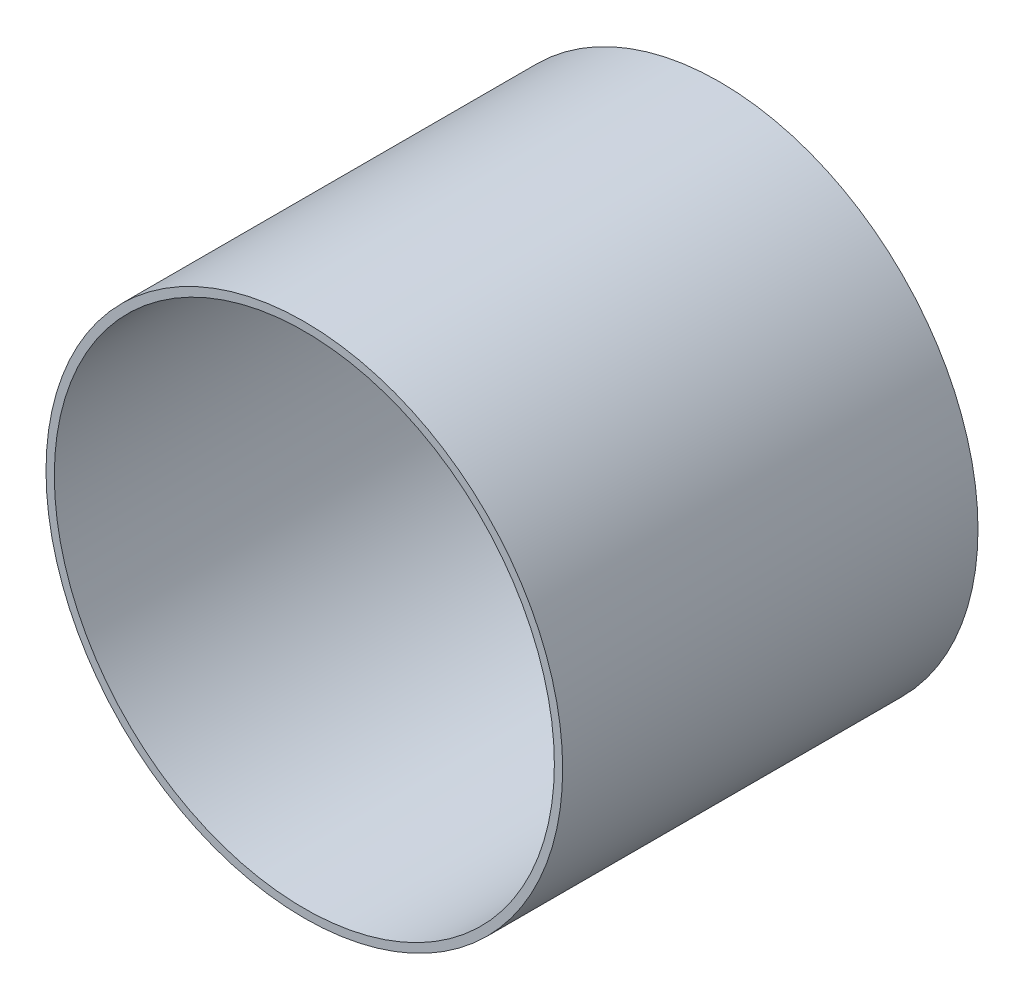
ISO-10303-21;
HEADER;
FILE_DESCRIPTION(('STEP AP214'),'2;1');
FILE_NAME('part.step','',(''),(''),'','','');
FILE_SCHEMA(('AUTOMOTIVE_DESIGN { 1 0 10303 214 1 1 1 1 }'));
ENDSEC;
DATA;
#1=APPLICATION_CONTEXT('core data for automotive mechanical design processes');
#2=APPLICATION_PROTOCOL_DEFINITION('international standard','automotive_design',2000,#1);
#3=PRODUCT_CONTEXT('',#1,'mechanical');
#4=PRODUCT('Part','Part','',(#3));
#5=PRODUCT_RELATED_PRODUCT_CATEGORY('part','',(#4));
#6=PRODUCT_DEFINITION_FORMATION('','',#4);
#7=PRODUCT_DEFINITION_CONTEXT('part definition',#1,'design');
#8=PRODUCT_DEFINITION('design','',#6,#7);
#9=PRODUCT_DEFINITION_SHAPE('','',#8);
#10=(LENGTH_UNIT() NAMED_UNIT(*) SI_UNIT(.MILLI.,.METRE.));
#11=(NAMED_UNIT(*) PLANE_ANGLE_UNIT() SI_UNIT($,.RADIAN.));
#12=(NAMED_UNIT(*) SI_UNIT($,.STERADIAN.) SOLID_ANGLE_UNIT());
#13=UNCERTAINTY_MEASURE_WITH_UNIT(LENGTH_MEASURE(1.E-05),#10,'distance_accuracy_value','');
#14=(GEOMETRIC_REPRESENTATION_CONTEXT(3) GLOBAL_UNCERTAINTY_ASSIGNED_CONTEXT((#13)) GLOBAL_UNIT_ASSIGNED_CONTEXT((#10,
#11,#12)) REPRESENTATION_CONTEXT('',''));
#15=CARTESIAN_POINT('',(0.,0.,0.));
#16=DIRECTION('',(0.,0.,1.));
#17=DIRECTION('',(1.,0.,0.));
#18=AXIS2_PLACEMENT_3D('',#15,#16,#17);
#19=CARTESIAN_POINT('',(0.,0.,50.));
#20=DIRECTION('',(0.,0.,1.));
#21=DIRECTION('',(1.,0.,0.));
#22=AXIS2_PLACEMENT_3D('',#19,#20,#21);
#23=PLANE('',#22);
#24=CARTESIAN_POINT('',(0.,0.,50.));
#25=DIRECTION('',(0.,0.,1.));
#26=DIRECTION('',(1.,0.,0.));
#27=AXIS2_PLACEMENT_3D('',#24,#25,#26);
#28=CIRCLE('',#27,31.1);
#29=CARTESIAN_POINT('',(31.1,0.,50.));
#30=VERTEX_POINT('',#29);
#31=EDGE_CURVE('E10',#30,#30,#28,.T.);
#32=ORIENTED_EDGE('',*,*,#31,.T.);
#33=EDGE_LOOP('',(#32));
#34=FACE_BOUND('',#33,.T.);
#35=CARTESIAN_POINT('',(0.,0.,50.));
#36=DIRECTION('',(0.,0.,1.));
#37=DIRECTION('',(1.,0.,0.));
#38=AXIS2_PLACEMENT_3D('',#35,#36,#37);
#39=CIRCLE('',#38,30.1);
#40=CARTESIAN_POINT('',(30.1,0.,50.));
#41=VERTEX_POINT('',#40);
#42=EDGE_CURVE('E50',#41,#41,#39,.T.);
#43=ORIENTED_EDGE('',*,*,#42,.F.);
#44=EDGE_LOOP('',(#43));
#45=FACE_BOUND('',#44,.T.);
#46=ADVANCED_FACE('F39',(#34,#45),#23,.T.);
#47=CARTESIAN_POINT('',(0.,0.,0.));
#48=DIRECTION('',(0.,0.,1.));
#49=DIRECTION('',(1.,0.,0.));
#50=AXIS2_PLACEMENT_3D('',#47,#48,#49);
#51=PLANE('',#50);
#52=CARTESIAN_POINT('',(0.,0.,0.));
#53=DIRECTION('',(0.,0.,1.));
#54=DIRECTION('',(1.,0.,0.));
#55=AXIS2_PLACEMENT_3D('',#52,#53,#54);
#56=CIRCLE('',#55,31.1);
#57=CARTESIAN_POINT('',(31.1,0.,0.));
#58=VERTEX_POINT('',#57);
#59=EDGE_CURVE('E43',#58,#58,#56,.T.);
#60=ORIENTED_EDGE('',*,*,#59,.F.);
#61=EDGE_LOOP('',(#60));
#62=FACE_BOUND('',#61,.T.);
#63=CARTESIAN_POINT('',(0.,0.,0.));
#64=DIRECTION('',(0.,0.,1.));
#65=DIRECTION('',(1.,0.,0.));
#66=AXIS2_PLACEMENT_3D('',#63,#64,#65);
#67=CIRCLE('',#66,30.1);
#68=CARTESIAN_POINT('',(30.1,0.,0.));
#69=VERTEX_POINT('',#68);
#70=EDGE_CURVE('E52',#69,#69,#67,.T.);
#71=ORIENTED_EDGE('',*,*,#70,.T.);
#72=EDGE_LOOP('',(#71));
#73=FACE_BOUND('',#72,.T.);
#74=ADVANCED_FACE('F62',(#62,#73),#51,.F.);
#75=CARTESIAN_POINT('',(0.,0.,50.));
#76=DIRECTION('',(0.,0.,-1.));
#77=DIRECTION('',(-1.,0.,0.));
#78=AXIS2_PLACEMENT_3D('',#75,#76,#77);
#79=CYLINDRICAL_SURFACE('',#78,31.1);
#80=ORIENTED_EDGE('',*,*,#31,.F.);
#81=EDGE_LOOP('',(#80));
#82=FACE_BOUND('',#81,.T.);
#83=ORIENTED_EDGE('',*,*,#59,.T.);
#84=EDGE_LOOP('',(#83));
#85=FACE_BOUND('',#84,.T.);
#86=ADVANCED_FACE('F41',(#82,#85),#79,.T.);
#87=CARTESIAN_POINT('',(0.,0.,50.));
#88=DIRECTION('',(0.,0.,-1.));
#89=DIRECTION('',(-1.,0.,0.));
#90=AXIS2_PLACEMENT_3D('',#87,#88,#89);
#91=CYLINDRICAL_SURFACE('',#90,30.1);
#92=ORIENTED_EDGE('',*,*,#42,.T.);
#93=EDGE_LOOP('',(#92));
#94=FACE_BOUND('',#93,.T.);
#95=ORIENTED_EDGE('',*,*,#70,.F.);
#96=EDGE_LOOP('',(#95));
#97=FACE_BOUND('',#96,.T.);
#98=ADVANCED_FACE('F58',(#94,#97),#91,.F.);
#99=CLOSED_SHELL('',(#46,#74,#86,#98));
#100=MANIFOLD_SOLID_BREP('B2',#99);
#101=ADVANCED_BREP_SHAPE_REPRESENTATION('',(#18,#100),#14);
#102=SHAPE_DEFINITION_REPRESENTATION(#9,#101);
ENDSEC;
END-ISO-10303-21;
